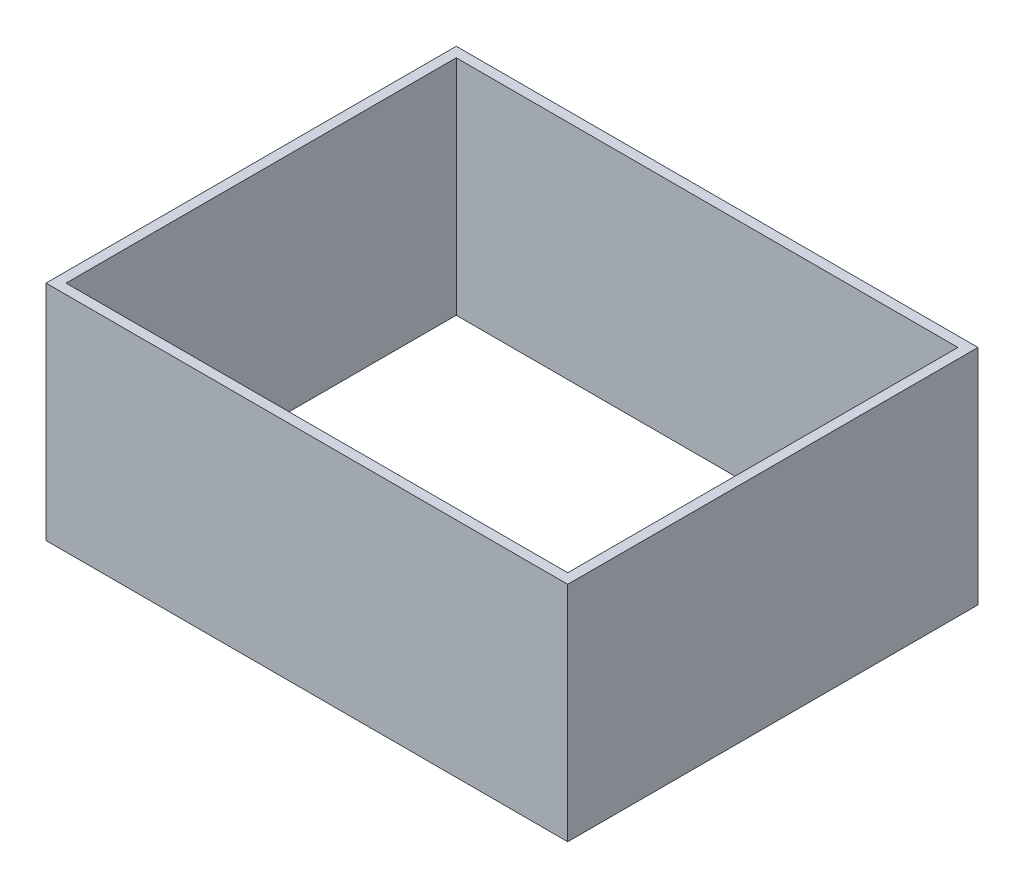
ISO-10303-21;
HEADER;
FILE_DESCRIPTION(('STEP AP214'),'2;1');
FILE_NAME('part.step','',(''),(''),'','','');
FILE_SCHEMA(('AUTOMOTIVE_DESIGN { 1 0 10303 214 1 1 1 1 }'));
ENDSEC;
DATA;
#1=APPLICATION_CONTEXT('core data for automotive mechanical design processes');
#2=APPLICATION_PROTOCOL_DEFINITION('international standard','automotive_design',2000,#1);
#3=PRODUCT_CONTEXT('',#1,'mechanical');
#4=PRODUCT('Part','Part','',(#3));
#5=PRODUCT_RELATED_PRODUCT_CATEGORY('part','',(#4));
#6=PRODUCT_DEFINITION_FORMATION('','',#4);
#7=PRODUCT_DEFINITION_CONTEXT('part definition',#1,'design');
#8=PRODUCT_DEFINITION('design','',#6,#7);
#9=PRODUCT_DEFINITION_SHAPE('','',#8);
#10=(LENGTH_UNIT() NAMED_UNIT(*) SI_UNIT(.MILLI.,.METRE.));
#11=(NAMED_UNIT(*) PLANE_ANGLE_UNIT() SI_UNIT($,.RADIAN.));
#12=(NAMED_UNIT(*) SI_UNIT($,.STERADIAN.) SOLID_ANGLE_UNIT());
#13=UNCERTAINTY_MEASURE_WITH_UNIT(LENGTH_MEASURE(1.E-05),#10,'distance_accuracy_value','');
#14=(GEOMETRIC_REPRESENTATION_CONTEXT(3) GLOBAL_UNCERTAINTY_ASSIGNED_CONTEXT((#13)) GLOBAL_UNIT_ASSIGNED_CONTEXT((#10,
#11,#12)) REPRESENTATION_CONTEXT('',''));
#15=CARTESIAN_POINT('',(0.,0.,0.));
#16=DIRECTION('',(0.,0.,1.));
#17=DIRECTION('',(1.,0.,0.));
#18=AXIS2_PLACEMENT_3D('',#15,#16,#17);
#19=CARTESIAN_POINT('',(0.,400.,0.));
#20=DIRECTION('',(0.,-1.,0.));
#21=DIRECTION('',(0.,0.,-1.));
#22=AXIS2_PLACEMENT_3D('',#19,#20,#21);
#23=PLANE('',#22);
#24=DIRECTION('',(-1.,0.,0.));
#25=VECTOR('',#24,1.);
#26=CARTESIAN_POINT('',(5.07692307692311,400.,-18.));
#27=LINE('',#26,#25);
#28=CARTESIAN_POINT('',(941.076923076923,400.,-18.));
#29=VERTEX_POINT('',#28);
#30=CARTESIAN_POINT('',(5.07692307692311,400.,-18.));
#31=VERTEX_POINT('',#30);
#32=EDGE_CURVE('E136',#29,#31,#27,.T.);
#33=ORIENTED_EDGE('',*,*,#32,.T.);
#34=DIRECTION('',(0.,0.,1.));
#35=VECTOR('',#34,1.);
#36=CARTESIAN_POINT('',(5.07692307692311,400.,-18.));
#37=LINE('',#36,#35);
#38=CARTESIAN_POINT('',(5.07692307692319,400.,718.));
#39=VERTEX_POINT('',#38);
#40=EDGE_CURVE('E139',#31,#39,#37,.T.);
#41=ORIENTED_EDGE('',*,*,#40,.T.);
#42=DIRECTION('',(1.,0.,0.));
#43=VECTOR('',#42,1.);
#44=CARTESIAN_POINT('',(5.07692307692319,400.,718.));
#45=LINE('',#44,#43);
#46=CARTESIAN_POINT('',(941.076923076923,400.,718.));
#47=VERTEX_POINT('',#46);
#48=EDGE_CURVE('E142',#39,#47,#45,.T.);
#49=ORIENTED_EDGE('',*,*,#48,.T.);
#50=DIRECTION('',(0.,0.,-1.));
#51=VECTOR('',#50,1.);
#52=CARTESIAN_POINT('',(941.076923076923,400.,-18.));
#53=LINE('',#52,#51);
#54=EDGE_CURVE('E144',#47,#29,#53,.T.);
#55=ORIENTED_EDGE('',*,*,#54,.T.);
#56=EDGE_LOOP('',(#33,#41,#49,#55));
#57=FACE_BOUND('',#56,.T.);
#58=DIRECTION('',(0.,0.,1.));
#59=VECTOR('',#58,1.);
#60=CARTESIAN_POINT('',(23.0769230769231,400.,0.));
#61=LINE('',#60,#59);
#62=CARTESIAN_POINT('',(23.0769230769231,400.,0.));
#63=VERTEX_POINT('',#62);
#64=CARTESIAN_POINT('',(23.0769230769232,400.,700.));
#65=VERTEX_POINT('',#64);
#66=EDGE_CURVE('E100',#63,#65,#61,.T.);
#67=ORIENTED_EDGE('',*,*,#66,.F.);
#68=DIRECTION('',(-1.,0.,0.));
#69=VECTOR('',#68,1.);
#70=CARTESIAN_POINT('',(23.0769230769231,400.,0.));
#71=LINE('',#70,#69);
#72=CARTESIAN_POINT('',(923.076923076923,400.,0.));
#73=VERTEX_POINT('',#72);
#74=EDGE_CURVE('E122',#73,#63,#71,.T.);
#75=ORIENTED_EDGE('',*,*,#74,.F.);
#76=DIRECTION('',(0.,0.,-1.));
#77=VECTOR('',#76,1.);
#78=CARTESIAN_POINT('',(923.076923076923,400.,0.));
#79=LINE('',#78,#77);
#80=CARTESIAN_POINT('',(923.076923076923,400.,700.));
#81=VERTEX_POINT('',#80);
#82=EDGE_CURVE('E120',#81,#73,#79,.T.);
#83=ORIENTED_EDGE('',*,*,#82,.F.);
#84=DIRECTION('',(1.,0.,0.));
#85=VECTOR('',#84,1.);
#86=CARTESIAN_POINT('',(23.0769230769232,400.,700.));
#87=LINE('',#86,#85);
#88=EDGE_CURVE('E108',#65,#81,#87,.T.);
#89=ORIENTED_EDGE('',*,*,#88,.F.);
#90=EDGE_LOOP('',(#67,#75,#83,#89));
#91=FACE_BOUND('',#90,.T.);
#92=ADVANCED_FACE('F35',(#57,#91),#23,.F.);
#93=CARTESIAN_POINT('',(0.,0.,0.));
#94=DIRECTION('',(0.,-1.,0.));
#95=DIRECTION('',(0.,0.,-1.));
#96=AXIS2_PLACEMENT_3D('',#93,#94,#95);
#97=PLANE('',#96);
#98=DIRECTION('',(-1.,0.,0.));
#99=VECTOR('',#98,1.);
#100=CARTESIAN_POINT('',(5.07692307692311,0.,-18.));
#101=LINE('',#100,#99);
#102=CARTESIAN_POINT('',(941.076923076923,0.,-18.));
#103=VERTEX_POINT('',#102);
#104=CARTESIAN_POINT('',(5.07692307692311,0.,-18.));
#105=VERTEX_POINT('',#104);
#106=EDGE_CURVE('E116',#103,#105,#101,.T.);
#107=ORIENTED_EDGE('',*,*,#106,.F.);
#108=DIRECTION('',(0.,0.,-1.));
#109=VECTOR('',#108,1.);
#110=CARTESIAN_POINT('',(941.076923076923,0.,-18.));
#111=LINE('',#110,#109);
#112=CARTESIAN_POINT('',(941.076923076923,0.,718.));
#113=VERTEX_POINT('',#112);
#114=EDGE_CURVE('E140',#113,#103,#111,.T.);
#115=ORIENTED_EDGE('',*,*,#114,.F.);
#116=DIRECTION('',(1.,0.,0.));
#117=VECTOR('',#116,1.);
#118=CARTESIAN_POINT('',(5.07692307692319,0.,718.));
#119=LINE('',#118,#117);
#120=CARTESIAN_POINT('',(5.07692307692319,0.,718.));
#121=VERTEX_POINT('',#120);
#122=EDGE_CURVE('E151',#121,#113,#119,.T.);
#123=ORIENTED_EDGE('',*,*,#122,.F.);
#124=DIRECTION('',(0.,0.,1.));
#125=VECTOR('',#124,1.);
#126=CARTESIAN_POINT('',(5.07692307692311,0.,-18.));
#127=LINE('',#126,#125);
#128=EDGE_CURVE('E149',#105,#121,#127,.T.);
#129=ORIENTED_EDGE('',*,*,#128,.F.);
#130=EDGE_LOOP('',(#107,#115,#123,#129));
#131=FACE_BOUND('',#130,.T.);
#132=DIRECTION('',(-1.,0.,0.));
#133=VECTOR('',#132,1.);
#134=CARTESIAN_POINT('',(23.0769230769231,0.,0.));
#135=LINE('',#134,#133);
#136=CARTESIAN_POINT('',(923.076923076923,0.,0.));
#137=VERTEX_POINT('',#136);
#138=CARTESIAN_POINT('',(23.0769230769231,0.,0.));
#139=VERTEX_POINT('',#138);
#140=EDGE_CURVE('E109',#137,#139,#135,.T.);
#141=ORIENTED_EDGE('',*,*,#140,.T.);
#142=DIRECTION('',(0.,0.,1.));
#143=VECTOR('',#142,1.);
#144=CARTESIAN_POINT('',(23.0769230769231,0.,0.));
#145=LINE('',#144,#143);
#146=CARTESIAN_POINT('',(23.0769230769232,0.,700.));
#147=VERTEX_POINT('',#146);
#148=EDGE_CURVE('E58',#139,#147,#145,.T.);
#149=ORIENTED_EDGE('',*,*,#148,.T.);
#150=DIRECTION('',(1.,0.,0.));
#151=VECTOR('',#150,1.);
#152=CARTESIAN_POINT('',(23.0769230769232,0.,700.));
#153=LINE('',#152,#151);
#154=CARTESIAN_POINT('',(923.076923076923,0.,700.));
#155=VERTEX_POINT('',#154);
#156=EDGE_CURVE('E115',#147,#155,#153,.T.);
#157=ORIENTED_EDGE('',*,*,#156,.T.);
#158=DIRECTION('',(0.,0.,-1.));
#159=VECTOR('',#158,1.);
#160=CARTESIAN_POINT('',(923.076923076923,0.,0.));
#161=LINE('',#160,#159);
#162=EDGE_CURVE('E128',#155,#137,#161,.T.);
#163=ORIENTED_EDGE('',*,*,#162,.T.);
#164=EDGE_LOOP('',(#141,#149,#157,#163));
#165=FACE_BOUND('',#164,.T.);
#166=ADVANCED_FACE('F169',(#131,#165),#97,.T.);
#167=CARTESIAN_POINT('',(5.07692307692311,400.,-18.));
#168=DIRECTION('',(0.,0.,1.));
#169=DIRECTION('',(1.,0.,0.));
#170=AXIS2_PLACEMENT_3D('',#167,#168,#169);
#171=PLANE('',#170);
#172=ORIENTED_EDGE('',*,*,#106,.T.);
#173=DIRECTION('',(0.,-1.,0.));
#174=VECTOR('',#173,1.);
#175=CARTESIAN_POINT('',(5.07692307692311,400.,-18.));
#176=LINE('',#175,#174);
#177=EDGE_CURVE('E11',#31,#105,#176,.T.);
#178=ORIENTED_EDGE('',*,*,#177,.F.);
#179=ORIENTED_EDGE('',*,*,#32,.F.);
#180=DIRECTION('',(0.,-1.,0.));
#181=VECTOR('',#180,1.);
#182=CARTESIAN_POINT('',(941.076923076923,400.,-18.));
#183=LINE('',#182,#181);
#184=EDGE_CURVE('E146',#29,#103,#183,.T.);
#185=ORIENTED_EDGE('',*,*,#184,.T.);
#186=EDGE_LOOP('',(#172,#178,#179,#185));
#187=FACE_BOUND('',#186,.T.);
#188=ADVANCED_FACE('F37',(#187),#171,.F.);
#189=CARTESIAN_POINT('',(5.07692307692311,400.,-18.));
#190=DIRECTION('',(1.,0.,0.));
#191=DIRECTION('',(0.,0.,-1.));
#192=AXIS2_PLACEMENT_3D('',#189,#190,#191);
#193=PLANE('',#192);
#194=ORIENTED_EDGE('',*,*,#128,.T.);
#195=DIRECTION('',(0.,-1.,0.));
#196=VECTOR('',#195,1.);
#197=CARTESIAN_POINT('',(5.07692307692319,400.,718.));
#198=LINE('',#197,#196);
#199=EDGE_CURVE('E43',#39,#121,#198,.T.);
#200=ORIENTED_EDGE('',*,*,#199,.F.);
#201=ORIENTED_EDGE('',*,*,#40,.F.);
#202=ORIENTED_EDGE('',*,*,#177,.T.);
#203=EDGE_LOOP('',(#194,#200,#201,#202));
#204=FACE_BOUND('',#203,.T.);
#205=ADVANCED_FACE('F179',(#204),#193,.F.);
#206=CARTESIAN_POINT('',(5.07692307692319,400.,718.));
#207=DIRECTION('',(0.,0.,-1.));
#208=DIRECTION('',(-1.,0.,0.));
#209=AXIS2_PLACEMENT_3D('',#206,#207,#208);
#210=PLANE('',#209);
#211=ORIENTED_EDGE('',*,*,#122,.T.);
#212=DIRECTION('',(0.,-1.,0.));
#213=VECTOR('',#212,1.);
#214=CARTESIAN_POINT('',(941.076923076923,400.,718.));
#215=LINE('',#214,#213);
#216=EDGE_CURVE('E156',#47,#113,#215,.T.);
#217=ORIENTED_EDGE('',*,*,#216,.F.);
#218=ORIENTED_EDGE('',*,*,#48,.F.);
#219=ORIENTED_EDGE('',*,*,#199,.T.);
#220=EDGE_LOOP('',(#211,#217,#218,#219));
#221=FACE_BOUND('',#220,.T.);
#222=ADVANCED_FACE('F163',(#221),#210,.F.);
#223=CARTESIAN_POINT('',(941.076923076923,400.,-18.));
#224=DIRECTION('',(-1.,0.,0.));
#225=DIRECTION('',(0.,0.,1.));
#226=AXIS2_PLACEMENT_3D('',#223,#224,#225);
#227=PLANE('',#226);
#228=ORIENTED_EDGE('',*,*,#114,.T.);
#229=ORIENTED_EDGE('',*,*,#184,.F.);
#230=ORIENTED_EDGE('',*,*,#54,.F.);
#231=ORIENTED_EDGE('',*,*,#216,.T.);
#232=EDGE_LOOP('',(#228,#229,#230,#231));
#233=FACE_BOUND('',#232,.T.);
#234=ADVANCED_FACE('F173',(#233),#227,.F.);
#235=CARTESIAN_POINT('',(23.0769230769231,400.,0.));
#236=DIRECTION('',(1.,0.,0.));
#237=DIRECTION('',(0.,0.,-1.));
#238=AXIS2_PLACEMENT_3D('',#235,#236,#237);
#239=PLANE('',#238);
#240=ORIENTED_EDGE('',*,*,#148,.F.);
#241=DIRECTION('',(0.,-1.,0.));
#242=VECTOR('',#241,1.);
#243=CARTESIAN_POINT('',(23.0769230769231,400.,0.));
#244=LINE('',#243,#242);
#245=EDGE_CURVE('E104',#63,#139,#244,.T.);
#246=ORIENTED_EDGE('',*,*,#245,.F.);
#247=ORIENTED_EDGE('',*,*,#66,.T.);
#248=DIRECTION('',(0.,-1.,0.));
#249=VECTOR('',#248,1.);
#250=CARTESIAN_POINT('',(23.0769230769232,400.,700.));
#251=LINE('',#250,#249);
#252=EDGE_CURVE('E103',#65,#147,#251,.T.);
#253=ORIENTED_EDGE('',*,*,#252,.T.);
#254=EDGE_LOOP('',(#240,#246,#247,#253));
#255=FACE_BOUND('',#254,.T.);
#256=ADVANCED_FACE('F102',(#255),#239,.T.);
#257=CARTESIAN_POINT('',(23.0769230769232,400.,700.));
#258=DIRECTION('',(0.,0.,-1.));
#259=DIRECTION('',(-1.,0.,0.));
#260=AXIS2_PLACEMENT_3D('',#257,#258,#259);
#261=PLANE('',#260);
#262=ORIENTED_EDGE('',*,*,#156,.F.);
#263=ORIENTED_EDGE('',*,*,#252,.F.);
#264=ORIENTED_EDGE('',*,*,#88,.T.);
#265=DIRECTION('',(0.,-1.,0.));
#266=VECTOR('',#265,1.);
#267=CARTESIAN_POINT('',(923.076923076923,400.,700.));
#268=LINE('',#267,#266);
#269=EDGE_CURVE('E117',#81,#155,#268,.T.);
#270=ORIENTED_EDGE('',*,*,#269,.T.);
#271=EDGE_LOOP('',(#262,#263,#264,#270));
#272=FACE_BOUND('',#271,.T.);
#273=ADVANCED_FACE('F112',(#272),#261,.T.);
#274=CARTESIAN_POINT('',(923.076923076923,400.,0.));
#275=DIRECTION('',(-1.,0.,0.));
#276=DIRECTION('',(0.,0.,1.));
#277=AXIS2_PLACEMENT_3D('',#274,#275,#276);
#278=PLANE('',#277);
#279=ORIENTED_EDGE('',*,*,#162,.F.);
#280=ORIENTED_EDGE('',*,*,#269,.F.);
#281=ORIENTED_EDGE('',*,*,#82,.T.);
#282=DIRECTION('',(0.,-1.,0.));
#283=VECTOR('',#282,1.);
#284=CARTESIAN_POINT('',(923.076923076923,400.,0.));
#285=LINE('',#284,#283);
#286=EDGE_CURVE('E50',#73,#137,#285,.T.);
#287=ORIENTED_EDGE('',*,*,#286,.T.);
#288=EDGE_LOOP('',(#279,#280,#281,#287));
#289=FACE_BOUND('',#288,.T.);
#290=ADVANCED_FACE('F202',(#289),#278,.T.);
#291=CARTESIAN_POINT('',(23.0769230769231,400.,0.));
#292=DIRECTION('',(0.,0.,1.));
#293=DIRECTION('',(1.,0.,0.));
#294=AXIS2_PLACEMENT_3D('',#291,#292,#293);
#295=PLANE('',#294);
#296=ORIENTED_EDGE('',*,*,#140,.F.);
#297=ORIENTED_EDGE('',*,*,#286,.F.);
#298=ORIENTED_EDGE('',*,*,#74,.T.);
#299=ORIENTED_EDGE('',*,*,#245,.T.);
#300=EDGE_LOOP('',(#296,#297,#298,#299));
#301=FACE_BOUND('',#300,.T.);
#302=ADVANCED_FACE('F206',(#301),#295,.T.);
#303=CLOSED_SHELL('',(#92,#166,#188,#205,#222,#234,#256,#273,#290,#302));
#304=MANIFOLD_SOLID_BREP('B2',#303);
#305=ADVANCED_BREP_SHAPE_REPRESENTATION('',(#18,#304),#14);
#306=SHAPE_DEFINITION_REPRESENTATION(#9,#305);
ENDSEC;
END-ISO-10303-21;
